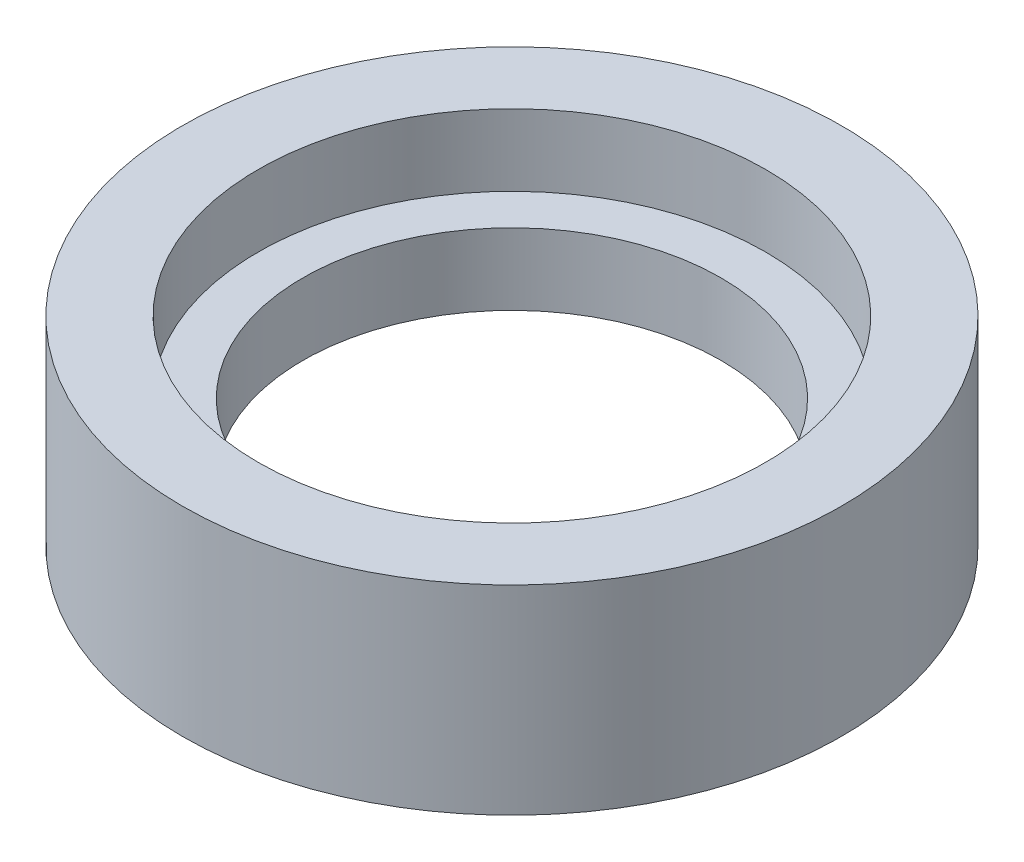
ISO-10303-21;
HEADER;
FILE_DESCRIPTION(('STEP AP214'),'2;1');
FILE_NAME('part.step','',(''),(''),'','','');
FILE_SCHEMA(('AUTOMOTIVE_DESIGN { 1 0 10303 214 1 1 1 1 }'));
ENDSEC;
DATA;
#1=APPLICATION_CONTEXT('core data for automotive mechanical design processes');
#2=APPLICATION_PROTOCOL_DEFINITION('international standard','automotive_design',2000,#1);
#3=PRODUCT_CONTEXT('',#1,'mechanical');
#4=PRODUCT('Part','Part','',(#3));
#5=PRODUCT_RELATED_PRODUCT_CATEGORY('part','',(#4));
#6=PRODUCT_DEFINITION_FORMATION('','',#4);
#7=PRODUCT_DEFINITION_CONTEXT('part definition',#1,'design');
#8=PRODUCT_DEFINITION('design','',#6,#7);
#9=PRODUCT_DEFINITION_SHAPE('','',#8);
#10=(LENGTH_UNIT() NAMED_UNIT(*) SI_UNIT(.MILLI.,.METRE.));
#11=(NAMED_UNIT(*) PLANE_ANGLE_UNIT() SI_UNIT($,.RADIAN.));
#12=(NAMED_UNIT(*) SI_UNIT($,.STERADIAN.) SOLID_ANGLE_UNIT());
#13=UNCERTAINTY_MEASURE_WITH_UNIT(LENGTH_MEASURE(1.E-05),#10,'distance_accuracy_value','');
#14=(GEOMETRIC_REPRESENTATION_CONTEXT(3) GLOBAL_UNCERTAINTY_ASSIGNED_CONTEXT((#13)) GLOBAL_UNIT_ASSIGNED_CONTEXT((#10,
#11,#12)) REPRESENTATION_CONTEXT('',''));
#15=CARTESIAN_POINT('',(0.,0.,0.));
#16=DIRECTION('',(0.,0.,1.));
#17=DIRECTION('',(1.,0.,0.));
#18=AXIS2_PLACEMENT_3D('',#15,#16,#17);
#19=CARTESIAN_POINT('',(-29.25,0.,0.));
#20=DIRECTION('',(0.,-1.,0.));
#21=DIRECTION('',(0.,0.,-1.));
#22=AXIS2_PLACEMENT_3D('',#19,#20,#21);
#23=PLANE('',#22);
#24=CARTESIAN_POINT('',(0.,0.,0.));
#25=DIRECTION('',(0.,1.,0.));
#26=DIRECTION('',(0.,0.,1.));
#27=AXIS2_PLACEMENT_3D('',#24,#25,#26);
#28=CIRCLE('',#27,20.4590119973034);
#29=CARTESIAN_POINT('',(0.,0.,20.4590119973034));
#30=VERTEX_POINT('',#29);
#31=EDGE_CURVE('E10',#30,#30,#28,.T.);
#32=ORIENTED_EDGE('',*,*,#31,.T.);
#33=EDGE_LOOP('',(#32));
#34=FACE_BOUND('',#33,.T.);
#35=CARTESIAN_POINT('',(0.,0.,0.));
#36=DIRECTION('',(0.,1.,0.));
#37=DIRECTION('',(0.,0.,1.));
#38=AXIS2_PLACEMENT_3D('',#35,#36,#37);
#39=CIRCLE('',#38,29.25);
#40=CARTESIAN_POINT('',(0.,0.,29.25));
#41=VERTEX_POINT('',#40);
#42=EDGE_CURVE('E58',#41,#41,#39,.T.);
#43=ORIENTED_EDGE('',*,*,#42,.F.);
#44=EDGE_LOOP('',(#43));
#45=FACE_BOUND('',#44,.T.);
#46=ADVANCED_FACE('F30',(#34,#45),#23,.T.);
#47=CARTESIAN_POINT('',(0.,39.6135955356996,0.));
#48=DIRECTION('',(0.,1.,0.));
#49=DIRECTION('',(0.,0.,1.));
#50=AXIS2_PLACEMENT_3D('',#47,#48,#49);
#51=CYLINDRICAL_SURFACE('',#50,20.4590119973034);
#52=CARTESIAN_POINT('',(0.,7.,0.));
#53=DIRECTION('',(0.,1.,0.));
#54=DIRECTION('',(0.,0.,1.));
#55=AXIS2_PLACEMENT_3D('',#52,#53,#54);
#56=CIRCLE('',#55,20.4590119973034);
#57=CARTESIAN_POINT('',(0.,7.,20.4590119973034));
#58=VERTEX_POINT('',#57);
#59=EDGE_CURVE('E36',#58,#58,#56,.T.);
#60=ORIENTED_EDGE('',*,*,#59,.T.);
#61=EDGE_LOOP('',(#60));
#62=FACE_BOUND('',#61,.T.);
#63=ORIENTED_EDGE('',*,*,#31,.F.);
#64=EDGE_LOOP('',(#63));
#65=FACE_BOUND('',#64,.T.);
#66=ADVANCED_FACE('F66',(#62,#65),#51,.F.);
#67=CARTESIAN_POINT('',(-20.4590119973034,7.,0.));
#68=DIRECTION('',(0.,1.,0.));
#69=DIRECTION('',(0.,0.,1.));
#70=AXIS2_PLACEMENT_3D('',#67,#68,#69);
#71=PLANE('',#70);
#72=CARTESIAN_POINT('',(0.,7.,0.));
#73=DIRECTION('',(0.,1.,0.));
#74=DIRECTION('',(0.,0.,1.));
#75=AXIS2_PLACEMENT_3D('',#72,#73,#74);
#76=CIRCLE('',#75,24.8294671911253);
#77=CARTESIAN_POINT('',(0.,7.,24.8294671911253));
#78=VERTEX_POINT('',#77);
#79=EDGE_CURVE('E40',#78,#78,#76,.T.);
#80=ORIENTED_EDGE('',*,*,#79,.T.);
#81=EDGE_LOOP('',(#80));
#82=FACE_BOUND('',#81,.T.);
#83=ORIENTED_EDGE('',*,*,#59,.F.);
#84=EDGE_LOOP('',(#83));
#85=FACE_BOUND('',#84,.T.);
#86=ADVANCED_FACE('F70',(#82,#85),#71,.T.);
#87=CARTESIAN_POINT('',(0.,39.6135955356996,0.));
#88=DIRECTION('',(0.,1.,0.));
#89=DIRECTION('',(0.,0.,1.));
#90=AXIS2_PLACEMENT_3D('',#87,#88,#89);
#91=CYLINDRICAL_SURFACE('',#90,24.8294671911253);
#92=CARTESIAN_POINT('',(0.,14.,0.));
#93=DIRECTION('',(0.,1.,0.));
#94=DIRECTION('',(0.,0.,1.));
#95=AXIS2_PLACEMENT_3D('',#92,#93,#94);
#96=CIRCLE('',#95,24.8294671911253);
#97=CARTESIAN_POINT('',(0.,14.,24.8294671911253));
#98=VERTEX_POINT('',#97);
#99=EDGE_CURVE('E44',#98,#98,#96,.T.);
#100=ORIENTED_EDGE('',*,*,#99,.T.);
#101=EDGE_LOOP('',(#100));
#102=FACE_BOUND('',#101,.T.);
#103=ORIENTED_EDGE('',*,*,#79,.F.);
#104=EDGE_LOOP('',(#103));
#105=FACE_BOUND('',#104,.T.);
#106=ADVANCED_FACE('F74',(#102,#105),#91,.F.);
#107=CARTESIAN_POINT('',(-24.8294671911253,14.,0.));
#108=DIRECTION('',(0.,1.,0.));
#109=DIRECTION('',(0.,0.,1.));
#110=AXIS2_PLACEMENT_3D('',#107,#108,#109);
#111=PLANE('',#110);
#112=CARTESIAN_POINT('',(0.,14.,0.));
#113=DIRECTION('',(0.,1.,0.));
#114=DIRECTION('',(0.,0.,1.));
#115=AXIS2_PLACEMENT_3D('',#112,#113,#114);
#116=CIRCLE('',#115,32.25);
#117=CARTESIAN_POINT('',(0.,14.,32.25));
#118=VERTEX_POINT('',#117);
#119=EDGE_CURVE('E49',#118,#118,#116,.T.);
#120=ORIENTED_EDGE('',*,*,#119,.T.);
#121=EDGE_LOOP('',(#120));
#122=FACE_BOUND('',#121,.T.);
#123=ORIENTED_EDGE('',*,*,#99,.F.);
#124=EDGE_LOOP('',(#123));
#125=FACE_BOUND('',#124,.T.);
#126=ADVANCED_FACE('F81',(#122,#125),#111,.T.);
#127=CARTESIAN_POINT('',(0.,39.6135955356996,0.));
#128=DIRECTION('',(0.,1.,0.));
#129=DIRECTION('',(0.,0.,1.));
#130=AXIS2_PLACEMENT_3D('',#127,#128,#129);
#131=CYLINDRICAL_SURFACE('',#130,32.25);
#132=CARTESIAN_POINT('',(0.,-5.51539391105446,0.));
#133=DIRECTION('',(0.,1.,0.));
#134=DIRECTION('',(0.,0.,1.));
#135=AXIS2_PLACEMENT_3D('',#132,#133,#134);
#136=CIRCLE('',#135,32.25);
#137=CARTESIAN_POINT('',(0.,-5.51539391105446,32.25));
#138=VERTEX_POINT('',#137);
#139=EDGE_CURVE('E52',#138,#138,#136,.T.);
#140=ORIENTED_EDGE('',*,*,#139,.T.);
#141=EDGE_LOOP('',(#140));
#142=FACE_BOUND('',#141,.T.);
#143=ORIENTED_EDGE('',*,*,#119,.F.);
#144=EDGE_LOOP('',(#143));
#145=FACE_BOUND('',#144,.T.);
#146=ADVANCED_FACE('F85',(#142,#145),#131,.T.);
#147=CARTESIAN_POINT('',(-32.25,-5.51539391105446,0.));
#148=DIRECTION('',(0.,-1.,0.));
#149=DIRECTION('',(0.,0.,-1.));
#150=AXIS2_PLACEMENT_3D('',#147,#148,#149);
#151=PLANE('',#150);
#152=CARTESIAN_POINT('',(0.,-5.51539391105446,0.));
#153=DIRECTION('',(0.,1.,0.));
#154=DIRECTION('',(0.,0.,1.));
#155=AXIS2_PLACEMENT_3D('',#152,#153,#154);
#156=CIRCLE('',#155,29.25);
#157=CARTESIAN_POINT('',(0.,-5.51539391105446,29.25));
#158=VERTEX_POINT('',#157);
#159=EDGE_CURVE('E55',#158,#158,#156,.T.);
#160=ORIENTED_EDGE('',*,*,#159,.T.);
#161=EDGE_LOOP('',(#160));
#162=FACE_BOUND('',#161,.T.);
#163=ORIENTED_EDGE('',*,*,#139,.F.);
#164=EDGE_LOOP('',(#163));
#165=FACE_BOUND('',#164,.T.);
#166=ADVANCED_FACE('F89',(#162,#165),#151,.T.);
#167=CARTESIAN_POINT('',(0.,39.6135955356996,0.));
#168=DIRECTION('',(0.,1.,0.));
#169=DIRECTION('',(0.,0.,1.));
#170=AXIS2_PLACEMENT_3D('',#167,#168,#169);
#171=CYLINDRICAL_SURFACE('',#170,29.25);
#172=ORIENTED_EDGE('',*,*,#42,.T.);
#173=EDGE_LOOP('',(#172));
#174=FACE_BOUND('',#173,.T.);
#175=ORIENTED_EDGE('',*,*,#159,.F.);
#176=EDGE_LOOP('',(#175));
#177=FACE_BOUND('',#176,.T.);
#178=ADVANCED_FACE('F62',(#174,#177),#171,.F.);
#179=CLOSED_SHELL('',(#46,#66,#86,#106,#126,#146,#166,#178));
#180=MANIFOLD_SOLID_BREP('B2',#179);
#181=ADVANCED_BREP_SHAPE_REPRESENTATION('',(#18,#180),#14);
#182=SHAPE_DEFINITION_REPRESENTATION(#9,#181);
ENDSEC;
END-ISO-10303-21;
